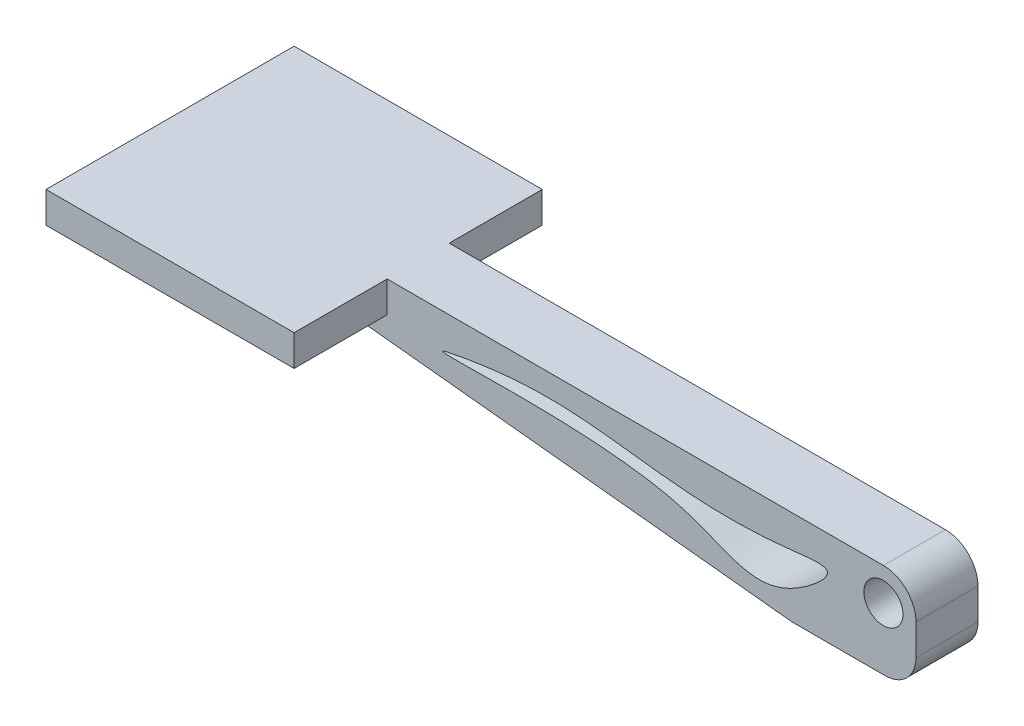
ISO-10303-21;
HEADER;
FILE_DESCRIPTION(('STEP AP214'),'2;1');
FILE_NAME('part.step','',(''),(''),'','','');
FILE_SCHEMA(('AUTOMOTIVE_DESIGN { 1 0 10303 214 1 1 1 1 }'));
ENDSEC;
DATA;
#1=APPLICATION_CONTEXT('core data for automotive mechanical design processes');
#2=APPLICATION_PROTOCOL_DEFINITION('international standard','automotive_design',2000,#1);
#3=PRODUCT_CONTEXT('',#1,'mechanical');
#4=PRODUCT('Part','Part','',(#3));
#5=PRODUCT_RELATED_PRODUCT_CATEGORY('part','',(#4));
#6=PRODUCT_DEFINITION_FORMATION('','',#4);
#7=PRODUCT_DEFINITION_CONTEXT('part definition',#1,'design');
#8=PRODUCT_DEFINITION('design','',#6,#7);
#9=PRODUCT_DEFINITION_SHAPE('','',#8);
#10=(LENGTH_UNIT() NAMED_UNIT(*) SI_UNIT(.MILLI.,.METRE.));
#11=(NAMED_UNIT(*) PLANE_ANGLE_UNIT() SI_UNIT($,.RADIAN.));
#12=(NAMED_UNIT(*) SI_UNIT($,.STERADIAN.) SOLID_ANGLE_UNIT());
#13=UNCERTAINTY_MEASURE_WITH_UNIT(LENGTH_MEASURE(1.E-05),#10,'distance_accuracy_value','');
#14=(GEOMETRIC_REPRESENTATION_CONTEXT(3) GLOBAL_UNCERTAINTY_ASSIGNED_CONTEXT((#13)) GLOBAL_UNIT_ASSIGNED_CONTEXT((#10,
#11,#12)) REPRESENTATION_CONTEXT('',''));
#15=CARTESIAN_POINT('',(0.,0.,0.));
#16=DIRECTION('',(0.,0.,1.));
#17=DIRECTION('',(1.,0.,0.));
#18=AXIS2_PLACEMENT_3D('',#15,#16,#17);
#19=CARTESIAN_POINT('',(-232.485951851655,5.29440272759926,-10.));
#20=DIRECTION('',(0.,0.,1.));
#21=DIRECTION('',(1.,0.,0.));
#22=AXIS2_PLACEMENT_3D('',#19,#20,#21);
#23=CYLINDRICAL_SURFACE('',#22,7.5);
#24=DIRECTION('',(0.,0.,1.));
#25=VECTOR('',#24,1.);
#26=CARTESIAN_POINT('',(-238.25342118279,0.499999999999965,-10.));
#27=LINE('',#26,#25);
#28=CARTESIAN_POINT('',(-238.25342118279,0.499999999999965,-10.));
#29=VERTEX_POINT('',#28);
#30=CARTESIAN_POINT('',(-238.25342118279,0.499999999999965,10.));
#31=VERTEX_POINT('',#30);
#32=EDGE_CURVE('E179',#29,#31,#27,.T.);
#33=ORIENTED_EDGE('',*,*,#32,.F.);
#34=CARTESIAN_POINT('',(-232.485951851655,5.29440272759926,-10.));
#35=DIRECTION('',(0.,0.,1.));
#36=DIRECTION('',(1.,0.,0.));
#37=AXIS2_PLACEMENT_3D('',#34,#35,#36);
#38=CIRCLE('',#37,7.5);
#39=CARTESIAN_POINT('',(-232.485951851655,-2.20559727240074,-10.));
#40=VERTEX_POINT('',#39);
#41=EDGE_CURVE('E230',#40,#29,#38,.F.);
#42=ORIENTED_EDGE('',*,*,#41,.F.);
#43=DIRECTION('',(0.,0.,1.));
#44=VECTOR('',#43,1.);
#45=CARTESIAN_POINT('',(-232.485951851655,-2.20559727240074,-10.));
#46=LINE('',#45,#44);
#47=CARTESIAN_POINT('',(-232.485951851655,-2.20559727240074,10.));
#48=VERTEX_POINT('',#47);
#49=EDGE_CURVE('E307',#40,#48,#46,.T.);
#50=ORIENTED_EDGE('',*,*,#49,.T.);
#51=CARTESIAN_POINT('',(-232.485951851655,5.29440272759926,10.));
#52=DIRECTION('',(0.,0.,1.));
#53=DIRECTION('',(1.,0.,0.));
#54=AXIS2_PLACEMENT_3D('',#51,#52,#53);
#55=CIRCLE('',#54,7.5);
#56=EDGE_CURVE('E193',#48,#31,#55,.F.);
#57=ORIENTED_EDGE('',*,*,#56,.T.);
#58=EDGE_LOOP('',(#33,#42,#50,#57));
#59=FACE_BOUND('',#58,.T.);
#60=ADVANCED_FACE('F39',(#59),#23,.T.);
#61=CARTESIAN_POINT('',(0.,0.,-10.));
#62=DIRECTION('',(0.,0.,1.));
#63=DIRECTION('',(1.,0.,0.));
#64=AXIS2_PLACEMENT_3D('',#61,#62,#63);
#65=CYLINDRICAL_SURFACE('',#64,10.5);
#66=DIRECTION('',(0.,0.,1.));
#67=VECTOR('',#66,1.);
#68=CARTESIAN_POINT('',(0.,10.5,-10.));
#69=LINE('',#68,#67);
#70=CARTESIAN_POINT('',(0.,10.5,-10.));
#71=VERTEX_POINT('',#70);
#72=CARTESIAN_POINT('',(0.,10.5,10.));
#73=VERTEX_POINT('',#72);
#74=EDGE_CURVE('E254',#71,#73,#69,.T.);
#75=ORIENTED_EDGE('',*,*,#74,.T.);
#76=CARTESIAN_POINT('',(0.,0.,10.));
#77=DIRECTION('',(0.,0.,1.));
#78=DIRECTION('',(1.,0.,0.));
#79=AXIS2_PLACEMENT_3D('',#76,#77,#78);
#80=CIRCLE('',#79,10.5);
#81=CARTESIAN_POINT('',(10.5,0.,10.));
#82=VERTEX_POINT('',#81);
#83=EDGE_CURVE('E188',#82,#73,#80,.T.);
#84=ORIENTED_EDGE('',*,*,#83,.F.);
#85=DIRECTION('',(0.,0.,1.));
#86=VECTOR('',#85,1.);
#87=CARTESIAN_POINT('',(10.5,0.,-10.));
#88=LINE('',#87,#86);
#89=CARTESIAN_POINT('',(10.5,0.,-10.));
#90=VERTEX_POINT('',#89);
#91=EDGE_CURVE('E255',#90,#82,#88,.T.);
#92=ORIENTED_EDGE('',*,*,#91,.F.);
#93=CARTESIAN_POINT('',(0.,0.,-10.));
#94=DIRECTION('',(0.,0.,1.));
#95=DIRECTION('',(1.,0.,0.));
#96=AXIS2_PLACEMENT_3D('',#93,#94,#95);
#97=CIRCLE('',#96,10.5);
#98=EDGE_CURVE('E225',#90,#71,#97,.T.);
#99=ORIENTED_EDGE('',*,*,#98,.T.);
#100=EDGE_LOOP('',(#75,#84,#92,#99));
#101=FACE_BOUND('',#100,.T.);
#102=ADVANCED_FACE('F272',(#101),#65,.T.);
#103=CARTESIAN_POINT('',(10.5,0.,-10.));
#104=DIRECTION('',(-1.,0.,0.));
#105=DIRECTION('',(0.,0.,1.));
#106=AXIS2_PLACEMENT_3D('',#103,#104,#105);
#107=PLANE('',#106);
#108=ORIENTED_EDGE('',*,*,#91,.T.);
#109=DIRECTION('',(0.,-1.,0.));
#110=VECTOR('',#109,1.);
#111=CARTESIAN_POINT('',(10.5,0.,10.));
#112=LINE('',#111,#110);
#113=CARTESIAN_POINT('',(10.5,-9.99999999999993,10.));
#114=VERTEX_POINT('',#113);
#115=EDGE_CURVE('E211',#82,#114,#112,.T.);
#116=ORIENTED_EDGE('',*,*,#115,.T.);
#117=DIRECTION('',(0.,0.,1.));
#118=VECTOR('',#117,1.);
#119=CARTESIAN_POINT('',(10.5,-9.99999999999993,-10.));
#120=LINE('',#119,#118);
#121=CARTESIAN_POINT('',(10.5,-9.99999999999993,-10.));
#122=VERTEX_POINT('',#121);
#123=EDGE_CURVE('E320',#122,#114,#120,.T.);
#124=ORIENTED_EDGE('',*,*,#123,.F.);
#125=DIRECTION('',(0.,-1.,0.));
#126=VECTOR('',#125,1.);
#127=CARTESIAN_POINT('',(10.5,0.,-10.));
#128=LINE('',#127,#126);
#129=EDGE_CURVE('E246',#90,#122,#128,.T.);
#130=ORIENTED_EDGE('',*,*,#129,.F.);
#131=EDGE_LOOP('',(#108,#116,#124,#130));
#132=FACE_BOUND('',#131,.T.);
#133=ADVANCED_FACE('F268',(#132),#107,.F.);
#134=CARTESIAN_POINT('',(0.500000000000002,-10.,-10.));
#135=DIRECTION('',(0.,0.,1.));
#136=DIRECTION('',(1.,0.,0.));
#137=AXIS2_PLACEMENT_3D('',#134,#135,#136);
#138=CYLINDRICAL_SURFACE('',#137,10.);
#139=ORIENTED_EDGE('',*,*,#123,.T.);
#140=CARTESIAN_POINT('',(0.500000000000002,-10.,10.));
#141=DIRECTION('',(0.,0.,1.));
#142=DIRECTION('',(1.,0.,0.));
#143=AXIS2_PLACEMENT_3D('',#140,#141,#142);
#144=CIRCLE('',#143,10.);
#145=CARTESIAN_POINT('',(0.499999999999931,-20.,10.));
#146=VERTEX_POINT('',#145);
#147=EDGE_CURVE('E208',#146,#114,#144,.T.);
#148=ORIENTED_EDGE('',*,*,#147,.F.);
#149=DIRECTION('',(0.,0.,1.));
#150=VECTOR('',#149,1.);
#151=CARTESIAN_POINT('',(0.499999999999931,-20.,-10.));
#152=LINE('',#151,#150);
#153=CARTESIAN_POINT('',(0.499999999999931,-20.,-10.));
#154=VERTEX_POINT('',#153);
#155=EDGE_CURVE('E321',#154,#146,#152,.T.);
#156=ORIENTED_EDGE('',*,*,#155,.F.);
#157=CARTESIAN_POINT('',(0.500000000000002,-10.,-10.));
#158=DIRECTION('',(0.,0.,1.));
#159=DIRECTION('',(1.,0.,0.));
#160=AXIS2_PLACEMENT_3D('',#157,#158,#159);
#161=CIRCLE('',#160,10.);
#162=EDGE_CURVE('E243',#154,#122,#161,.T.);
#163=ORIENTED_EDGE('',*,*,#162,.T.);
#164=EDGE_LOOP('',(#139,#148,#156,#163));
#165=FACE_BOUND('',#164,.T.);
#166=ADVANCED_FACE('F271',(#165),#138,.T.);
#167=CARTESIAN_POINT('',(0.,-20.,-10.));
#168=DIRECTION('',(0.,1.,0.));
#169=DIRECTION('',(-1.,0.,0.));
#170=AXIS2_PLACEMENT_3D('',#167,#168,#169);
#171=PLANE('',#170);
#172=ORIENTED_EDGE('',*,*,#155,.T.);
#173=DIRECTION('',(-1.,0.,0.));
#174=VECTOR('',#173,1.);
#175=CARTESIAN_POINT('',(0.,-20.,10.));
#176=LINE('',#175,#174);
#177=CARTESIAN_POINT('',(-29.5,-20.,10.));
#178=VERTEX_POINT('',#177);
#179=EDGE_CURVE('E205',#146,#178,#176,.T.);
#180=ORIENTED_EDGE('',*,*,#179,.T.);
#181=DIRECTION('',(0.,0.,1.));
#182=VECTOR('',#181,1.);
#183=CARTESIAN_POINT('',(-29.5,-20.,-10.));
#184=LINE('',#183,#182);
#185=CARTESIAN_POINT('',(-29.5,-20.,-10.));
#186=VERTEX_POINT('',#185);
#187=EDGE_CURVE('E322',#186,#178,#184,.T.);
#188=ORIENTED_EDGE('',*,*,#187,.F.);
#189=DIRECTION('',(-1.,0.,0.));
#190=VECTOR('',#189,1.);
#191=CARTESIAN_POINT('',(0.,-20.,-10.));
#192=LINE('',#191,#190);
#193=EDGE_CURVE('E240',#154,#186,#192,.T.);
#194=ORIENTED_EDGE('',*,*,#193,.F.);
#195=EDGE_LOOP('',(#172,#180,#188,#194));
#196=FACE_BOUND('',#195,.T.);
#197=ADVANCED_FACE('F276',(#196),#171,.F.);
#198=CARTESIAN_POINT('',(-2.38316479186402,-22.830584044961,-10.));
#199=DIRECTION('',(0.103820657672118,0.994596034096522,0.));
#200=DIRECTION('',(-0.994596034096522,0.103820657672118,0.));
#201=AXIS2_PLACEMENT_3D('',#198,#199,#200);
#202=PLANE('',#201);
#203=ORIENTED_EDGE('',*,*,#187,.T.);
#204=DIRECTION('',(-0.994596034096522,0.103820657672118,0.));
#205=VECTOR('',#204,1.);
#206=CARTESIAN_POINT('',(-2.38316479186402,-22.830584044961,10.));
#207=LINE('',#206,#205);
#208=CARTESIAN_POINT('',(-198.933978894846,-2.31367659047031,10.));
#209=VERTEX_POINT('',#208);
#210=EDGE_CURVE('E202',#178,#209,#207,.T.);
#211=ORIENTED_EDGE('',*,*,#210,.T.);
#212=DIRECTION('',(0.,0.,1.));
#213=VECTOR('',#212,1.);
#214=CARTESIAN_POINT('',(-198.933978894846,-2.31367659047031,-10.));
#215=LINE('',#214,#213);
#216=CARTESIAN_POINT('',(-198.933978894846,-2.31367659047031,-10.));
#217=VERTEX_POINT('',#216);
#218=EDGE_CURVE('E326',#217,#209,#215,.T.);
#219=ORIENTED_EDGE('',*,*,#218,.F.);
#220=DIRECTION('',(-0.994596034096522,0.103820657672118,0.));
#221=VECTOR('',#220,1.);
#222=CARTESIAN_POINT('',(-2.38316479186402,-22.830584044961,-10.));
#223=LINE('',#222,#221);
#224=EDGE_CURVE('E238',#186,#217,#223,.T.);
#225=ORIENTED_EDGE('',*,*,#224,.F.);
#226=EDGE_LOOP('',(#203,#211,#219,#225));
#227=FACE_BOUND('',#226,.T.);
#228=ADVANCED_FACE('F280',(#227),#202,.F.);
#229=CARTESIAN_POINT('',(-201.010392048289,-22.2055972724007,-10.));
#230=DIRECTION('',(0.,0.,1.));
#231=DIRECTION('',(1.,0.,0.));
#232=AXIS2_PLACEMENT_3D('',#229,#230,#231);
#233=CYLINDRICAL_SURFACE('',#232,20.);
#234=ORIENTED_EDGE('',*,*,#218,.T.);
#235=CARTESIAN_POINT('',(-201.010392048289,-22.2055972724007,10.));
#236=DIRECTION('',(0.,0.,1.));
#237=DIRECTION('',(1.,0.,0.));
#238=AXIS2_PLACEMENT_3D('',#235,#236,#237);
#239=CIRCLE('',#238,20.);
#240=CARTESIAN_POINT('',(-201.010392048289,-2.20559727240074,10.));
#241=VERTEX_POINT('',#240);
#242=EDGE_CURVE('E199',#241,#209,#239,.F.);
#243=ORIENTED_EDGE('',*,*,#242,.F.);
#244=DIRECTION('',(0.,0.,1.));
#245=VECTOR('',#244,1.);
#246=CARTESIAN_POINT('',(-201.010392048289,-2.20559727240074,-10.));
#247=LINE('',#246,#245);
#248=CARTESIAN_POINT('',(-201.010392048289,-2.20559727240074,-10.));
#249=VERTEX_POINT('',#248);
#250=EDGE_CURVE('E328',#249,#241,#247,.T.);
#251=ORIENTED_EDGE('',*,*,#250,.F.);
#252=CARTESIAN_POINT('',(-201.010392048289,-22.2055972724007,-10.));
#253=DIRECTION('',(0.,0.,1.));
#254=DIRECTION('',(1.,0.,0.));
#255=AXIS2_PLACEMENT_3D('',#252,#253,#254);
#256=CIRCLE('',#255,20.);
#257=EDGE_CURVE('E235',#249,#217,#256,.F.);
#258=ORIENTED_EDGE('',*,*,#257,.T.);
#259=EDGE_LOOP('',(#234,#243,#251,#258));
#260=FACE_BOUND('',#259,.T.);
#261=ADVANCED_FACE('F284',(#260),#233,.F.);
#262=CARTESIAN_POINT('',(0.,-2.20559727240071,-10.));
#263=DIRECTION('',(0.,1.,0.));
#264=DIRECTION('',(-1.,0.,0.));
#265=AXIS2_PLACEMENT_3D('',#262,#263,#264);
#266=PLANE('',#265);
#267=ORIENTED_EDGE('',*,*,#250,.T.);
#268=DIRECTION('',(-1.,0.,0.));
#269=VECTOR('',#268,1.);
#270=CARTESIAN_POINT('',(0.,-2.20559727240071,10.));
#271=LINE('',#270,#269);
#272=EDGE_CURVE('E196',#241,#48,#271,.T.);
#273=ORIENTED_EDGE('',*,*,#272,.T.);
#274=ORIENTED_EDGE('',*,*,#49,.F.);
#275=DIRECTION('',(-1.,0.,0.));
#276=VECTOR('',#275,1.);
#277=CARTESIAN_POINT('',(0.,-2.20559727240071,-10.));
#278=LINE('',#277,#276);
#279=EDGE_CURVE('E232',#249,#40,#278,.T.);
#280=ORIENTED_EDGE('',*,*,#279,.F.);
#281=EDGE_LOOP('',(#267,#273,#274,#280));
#282=FACE_BOUND('',#281,.T.);
#283=ADVANCED_FACE('F288',(#282),#266,.F.);
#284=CARTESIAN_POINT('',(0.,10.5,-10.));
#285=DIRECTION('',(0.,1.,0.));
#286=DIRECTION('',(-1.,0.,0.));
#287=AXIS2_PLACEMENT_3D('',#284,#285,#286);
#288=PLANE('',#287);
#289=DIRECTION('',(-1.,0.,0.));
#290=VECTOR('',#289,1.);
#291=CARTESIAN_POINT('',(0.,10.5,-10.));
#292=LINE('',#291,#290);
#293=CARTESIAN_POINT('',(-160.,10.5,-10.));
#294=VERTEX_POINT('',#293);
#295=EDGE_CURVE('E228',#71,#294,#292,.T.);
#296=ORIENTED_EDGE('',*,*,#295,.T.);
#297=DIRECTION('',(0.,0.,-1.));
#298=VECTOR('',#297,1.);
#299=CARTESIAN_POINT('',(-160.,10.5,0.));
#300=LINE('',#299,#298);
#301=CARTESIAN_POINT('',(-160.,10.5,-40.));
#302=VERTEX_POINT('',#301);
#303=EDGE_CURVE('E343',#294,#302,#300,.T.);
#304=ORIENTED_EDGE('',*,*,#303,.T.);
#305=DIRECTION('',(1.,0.,0.));
#306=VECTOR('',#305,1.);
#307=CARTESIAN_POINT('',(0.,10.5,-40.));
#308=LINE('',#307,#306);
#309=CARTESIAN_POINT('',(-240.,10.5,-40.));
#310=VERTEX_POINT('',#309);
#311=EDGE_CURVE('E169',#310,#302,#308,.T.);
#312=ORIENTED_EDGE('',*,*,#311,.F.);
#313=DIRECTION('',(0.,0.,-1.));
#314=VECTOR('',#313,1.);
#315=CARTESIAN_POINT('',(-240.,10.5,0.));
#316=LINE('',#315,#314);
#317=CARTESIAN_POINT('',(-240.,10.5,40.));
#318=VERTEX_POINT('',#317);
#319=EDGE_CURVE('E348',#318,#310,#316,.T.);
#320=ORIENTED_EDGE('',*,*,#319,.F.);
#321=DIRECTION('',(1.,0.,0.));
#322=VECTOR('',#321,1.);
#323=CARTESIAN_POINT('',(0.,10.5,40.));
#324=LINE('',#323,#322);
#325=CARTESIAN_POINT('',(-160.,10.5,40.));
#326=VERTEX_POINT('',#325);
#327=EDGE_CURVE('E155',#318,#326,#324,.T.);
#328=ORIENTED_EDGE('',*,*,#327,.T.);
#329=CARTESIAN_POINT('',(-160.,10.5,10.));
#330=VERTEX_POINT('',#329);
#331=EDGE_CURVE('E312',#326,#330,#300,.T.);
#332=ORIENTED_EDGE('',*,*,#331,.T.);
#333=DIRECTION('',(-1.,0.,0.));
#334=VECTOR('',#333,1.);
#335=CARTESIAN_POINT('',(0.,10.5,10.));
#336=LINE('',#335,#334);
#337=EDGE_CURVE('E191',#73,#330,#336,.T.);
#338=ORIENTED_EDGE('',*,*,#337,.F.);
#339=ORIENTED_EDGE('',*,*,#74,.F.);
#340=EDGE_LOOP('',(#296,#304,#312,#320,#328,#332,#338,#339));
#341=FACE_BOUND('',#340,.T.);
#342=ADVANCED_FACE('F292',(#341),#288,.T.);
#343=CARTESIAN_POINT('',(0.,0.,-10.));
#344=DIRECTION('',(0.,0.,1.));
#345=DIRECTION('',(1.,0.,0.));
#346=AXIS2_PLACEMENT_3D('',#343,#344,#345);
#347=CYLINDRICAL_SURFACE('',#346,6.3);
#348=CARTESIAN_POINT('',(0.,0.,-10.));
#349=DIRECTION('',(0.,0.,1.));
#350=DIRECTION('',(1.,0.,0.));
#351=AXIS2_PLACEMENT_3D('',#348,#349,#350);
#352=CIRCLE('',#351,6.3);
#353=CARTESIAN_POINT('',(6.3,0.,-10.));
#354=VERTEX_POINT('',#353);
#355=EDGE_CURVE('E219',#354,#354,#352,.T.);
#356=ORIENTED_EDGE('',*,*,#355,.F.);
#357=EDGE_LOOP('',(#356));
#358=FACE_BOUND('',#357,.T.);
#359=CARTESIAN_POINT('',(0.,0.,10.));
#360=DIRECTION('',(0.,0.,1.));
#361=DIRECTION('',(1.,0.,0.));
#362=AXIS2_PLACEMENT_3D('',#359,#360,#361);
#363=CIRCLE('',#362,6.3);
#364=CARTESIAN_POINT('',(6.3,0.,10.));
#365=VERTEX_POINT('',#364);
#366=EDGE_CURVE('E185',#365,#365,#363,.T.);
#367=ORIENTED_EDGE('',*,*,#366,.T.);
#368=EDGE_LOOP('',(#367));
#369=FACE_BOUND('',#368,.T.);
#370=ADVANCED_FACE('F41',(#358,#369),#347,.F.);
#371=CARTESIAN_POINT('',(-29.5,0.,-10.));
#372=CARTESIAN_POINT('',(-71.215452783542,-4.61892144301834,-10.));
#373=CARTESIAN_POINT('',(-91.249553359035,8.29560441948552,-10.));
#374=CARTESIAN_POINT('',(-167.314221677609,-4.51637823923124,-10.));
#375=CARTESIAN_POINT('',(-66.6604627525352,5.70599052736749,-10.));
#376=CARTESIAN_POINT('',(-39.3547437867582,-20.8236487299259,-10.));
#377=CARTESIAN_POINT('',(-11.8773746369472,2.38963550250183,-10.));
#378=CARTESIAN_POINT('',(-24.5233427174819,0.551037745078615,-10.));
#379=CARTESIAN_POINT('',(-29.5,0.,-10.));
#380=B_SPLINE_CURVE_WITH_KNOTS('',3,(#371,#372,#373,#374,#375,#376,#377,#378,#379),
.UNSPECIFIED.,.T.,.F.,(4,1,1,1,1,1,4),(0.,0.381705306503049,0.445280413079072,0.748987595762117,
0.891875490341652,0.954462522479591,1.),.UNSPECIFIED.);
#381=DIRECTION('',(0.,0.,1.));
#382=VECTOR('',#381,1.);
#383=SURFACE_OF_LINEAR_EXTRUSION('',#380,#382);
#384=CARTESIAN_POINT('',(-29.5,0.,-10.));
#385=VERTEX_POINT('',#384);
#386=EDGE_CURVE('E248',#385,#385,#380,.T.);
#387=ORIENTED_EDGE('',*,*,#386,.F.);
#388=EDGE_LOOP('',(#387));
#389=FACE_BOUND('',#388,.T.);
#390=CARTESIAN_POINT('',(-29.5,0.,10.));
#391=CARTESIAN_POINT('',(-71.215452783542,-4.61892144301834,10.));
#392=CARTESIAN_POINT('',(-91.249553359035,8.29560441948552,10.));
#393=CARTESIAN_POINT('',(-167.314221677609,-4.51637823923124,10.));
#394=CARTESIAN_POINT('',(-66.6604627525352,5.70599052736749,10.));
#395=CARTESIAN_POINT('',(-39.3547437867582,-20.8236487299259,10.));
#396=CARTESIAN_POINT('',(-11.8773746369472,2.38963550250183,10.));
#397=CARTESIAN_POINT('',(-24.5233427174819,0.551037745078615,10.));
#398=CARTESIAN_POINT('',(-29.5,0.,10.));
#399=B_SPLINE_CURVE_WITH_KNOTS('',3,(#390,#391,#392,#393,#394,#395,#396,#397,#398),
.UNSPECIFIED.,.T.,.F.,(4,1,1,1,1,1,4),(0.,0.381705306503049,0.445280413079072,0.748987595762117,
0.891875490341652,0.954462522479591,1.),.UNSPECIFIED.);
#400=CARTESIAN_POINT('',(-29.5,0.,10.));
#401=VERTEX_POINT('',#400);
#402=EDGE_CURVE('E214',#401,#401,#399,.T.);
#403=ORIENTED_EDGE('',*,*,#402,.T.);
#404=EDGE_LOOP('',(#403));
#405=FACE_BOUND('',#404,.T.);
#406=ADVANCED_FACE('F261',(#389,#405),#383,.F.);
#407=CARTESIAN_POINT('',(0.,0.,-10.));
#408=DIRECTION('',(0.,0.,1.));
#409=DIRECTION('',(1.,0.,0.));
#410=AXIS2_PLACEMENT_3D('',#407,#408,#409);
#411=PLANE('',#410);
#412=ORIENTED_EDGE('',*,*,#355,.T.);
#413=EDGE_LOOP('',(#412));
#414=FACE_BOUND('',#413,.T.);
#415=DIRECTION('',(-1.,0.,0.));
#416=VECTOR('',#415,1.);
#417=CARTESIAN_POINT('',(0.,0.5,-10.));
#418=LINE('',#417,#416);
#419=CARTESIAN_POINT('',(-160.,0.499999999999976,-10.));
#420=VERTEX_POINT('',#419);
#421=EDGE_CURVE('E54',#420,#29,#418,.T.);
#422=ORIENTED_EDGE('',*,*,#421,.F.);
#423=DIRECTION('',(0.,1.,0.));
#424=VECTOR('',#423,1.);
#425=CARTESIAN_POINT('',(-160.,0.,-10.));
#426=LINE('',#425,#424);
#427=EDGE_CURVE('E58',#420,#294,#426,.T.);
#428=ORIENTED_EDGE('',*,*,#427,.T.);
#429=ORIENTED_EDGE('',*,*,#295,.F.);
#430=ORIENTED_EDGE('',*,*,#98,.F.);
#431=ORIENTED_EDGE('',*,*,#129,.T.);
#432=ORIENTED_EDGE('',*,*,#162,.F.);
#433=ORIENTED_EDGE('',*,*,#193,.T.);
#434=ORIENTED_EDGE('',*,*,#224,.T.);
#435=ORIENTED_EDGE('',*,*,#257,.F.);
#436=ORIENTED_EDGE('',*,*,#279,.T.);
#437=ORIENTED_EDGE('',*,*,#41,.T.);
#438=EDGE_LOOP('',(#422,#428,#429,#430,#431,#432,#433,#434,#435,#436,#437));
#439=FACE_BOUND('',#438,.T.);
#440=ORIENTED_EDGE('',*,*,#386,.T.);
#441=EDGE_LOOP('',(#440));
#442=FACE_BOUND('',#441,.T.);
#443=ADVANCED_FACE('F265',(#414,#439,#442),#411,.F.);
#444=CARTESIAN_POINT('',(0.,0.,10.));
#445=DIRECTION('',(0.,0.,1.));
#446=DIRECTION('',(1.,0.,0.));
#447=AXIS2_PLACEMENT_3D('',#444,#445,#446);
#448=PLANE('',#447);
#449=DIRECTION('',(0.,1.,0.));
#450=VECTOR('',#449,1.);
#451=CARTESIAN_POINT('',(-160.,0.,10.));
#452=LINE('',#451,#450);
#453=CARTESIAN_POINT('',(-160.,0.499999999999976,10.));
#454=VERTEX_POINT('',#453);
#455=EDGE_CURVE('E11',#454,#330,#452,.T.);
#456=ORIENTED_EDGE('',*,*,#455,.F.);
#457=DIRECTION('',(-1.,0.,0.));
#458=VECTOR('',#457,1.);
#459=CARTESIAN_POINT('',(0.,0.5,10.));
#460=LINE('',#459,#458);
#461=EDGE_CURVE('E47',#454,#31,#460,.T.);
#462=ORIENTED_EDGE('',*,*,#461,.T.);
#463=ORIENTED_EDGE('',*,*,#56,.F.);
#464=ORIENTED_EDGE('',*,*,#272,.F.);
#465=ORIENTED_EDGE('',*,*,#242,.T.);
#466=ORIENTED_EDGE('',*,*,#210,.F.);
#467=ORIENTED_EDGE('',*,*,#179,.F.);
#468=ORIENTED_EDGE('',*,*,#147,.T.);
#469=ORIENTED_EDGE('',*,*,#115,.F.);
#470=ORIENTED_EDGE('',*,*,#83,.T.);
#471=ORIENTED_EDGE('',*,*,#337,.T.);
#472=EDGE_LOOP('',(#456,#462,#463,#464,#465,#466,#467,#468,#469,#470,#471));
#473=FACE_BOUND('',#472,.T.);
#474=ORIENTED_EDGE('',*,*,#366,.F.);
#475=EDGE_LOOP('',(#474));
#476=FACE_BOUND('',#475,.T.);
#477=ORIENTED_EDGE('',*,*,#402,.F.);
#478=EDGE_LOOP('',(#477));
#479=FACE_BOUND('',#478,.T.);
#480=ADVANCED_FACE('F314',(#473,#476,#479),#448,.T.);
#481=CARTESIAN_POINT('',(-160.,0.499999999999976,0.));
#482=DIRECTION('',(1.,0.,0.));
#483=DIRECTION('',(0.,1.,0.));
#484=AXIS2_PLACEMENT_3D('',#481,#482,#483);
#485=PLANE('',#484);
#486=ORIENTED_EDGE('',*,*,#427,.F.);
#487=DIRECTION('',(0.,0.,-1.));
#488=VECTOR('',#487,1.);
#489=CARTESIAN_POINT('',(-160.,0.499999999999976,0.));
#490=LINE('',#489,#488);
#491=CARTESIAN_POINT('',(-160.,0.499999999999976,-40.));
#492=VERTEX_POINT('',#491);
#493=EDGE_CURVE('E146',#420,#492,#490,.T.);
#494=ORIENTED_EDGE('',*,*,#493,.T.);
#495=DIRECTION('',(0.,1.,0.));
#496=VECTOR('',#495,1.);
#497=CARTESIAN_POINT('',(-160.,0.499999999999976,-40.));
#498=LINE('',#497,#496);
#499=EDGE_CURVE('E151',#492,#302,#498,.T.);
#500=ORIENTED_EDGE('',*,*,#499,.T.);
#501=ORIENTED_EDGE('',*,*,#303,.F.);
#502=EDGE_LOOP('',(#486,#494,#500,#501));
#503=FACE_BOUND('',#502,.T.);
#504=ADVANCED_FACE('F148',(#503),#485,.T.);
#505=CARTESIAN_POINT('',(0.,0.5,0.));
#506=DIRECTION('',(0.,1.,0.));
#507=DIRECTION('',(-1.,0.,0.));
#508=AXIS2_PLACEMENT_3D('',#505,#506,#507);
#509=PLANE('',#508);
#510=ORIENTED_EDGE('',*,*,#493,.F.);
#511=ORIENTED_EDGE('',*,*,#421,.T.);
#512=ORIENTED_EDGE('',*,*,#32,.T.);
#513=ORIENTED_EDGE('',*,*,#461,.F.);
#514=CARTESIAN_POINT('',(-160.,0.499999999999976,40.));
#515=VERTEX_POINT('',#514);
#516=EDGE_CURVE('E154',#515,#454,#490,.T.);
#517=ORIENTED_EDGE('',*,*,#516,.F.);
#518=DIRECTION('',(1.,0.,0.));
#519=VECTOR('',#518,1.);
#520=CARTESIAN_POINT('',(0.,0.5,40.));
#521=LINE('',#520,#519);
#522=CARTESIAN_POINT('',(-240.,0.499999999999964,40.));
#523=VERTEX_POINT('',#522);
#524=EDGE_CURVE('E171',#523,#515,#521,.T.);
#525=ORIENTED_EDGE('',*,*,#524,.F.);
#526=DIRECTION('',(0.,0.,-1.));
#527=VECTOR('',#526,1.);
#528=CARTESIAN_POINT('',(-240.,0.499999999999964,0.));
#529=LINE('',#528,#527);
#530=CARTESIAN_POINT('',(-240.,0.499999999999964,-40.));
#531=VERTEX_POINT('',#530);
#532=EDGE_CURVE('E162',#523,#531,#529,.T.);
#533=ORIENTED_EDGE('',*,*,#532,.T.);
#534=DIRECTION('',(1.,0.,0.));
#535=VECTOR('',#534,1.);
#536=CARTESIAN_POINT('',(0.,0.5,-40.));
#537=LINE('',#536,#535);
#538=EDGE_CURVE('E158',#531,#492,#537,.T.);
#539=ORIENTED_EDGE('',*,*,#538,.T.);
#540=EDGE_LOOP('',(#510,#511,#512,#513,#517,#525,#533,#539));
#541=FACE_BOUND('',#540,.T.);
#542=ADVANCED_FACE('F159',(#541),#509,.F.);
#543=ORIENTED_EDGE('',*,*,#516,.T.);
#544=ORIENTED_EDGE('',*,*,#455,.T.);
#545=ORIENTED_EDGE('',*,*,#331,.F.);
#546=DIRECTION('',(0.,1.,0.));
#547=VECTOR('',#546,1.);
#548=CARTESIAN_POINT('',(-160.,0.499999999999976,40.));
#549=LINE('',#548,#547);
#550=EDGE_CURVE('E182',#515,#326,#549,.T.);
#551=ORIENTED_EDGE('',*,*,#550,.F.);
#552=EDGE_LOOP('',(#543,#544,#545,#551));
#553=FACE_BOUND('',#552,.T.);
#554=ADVANCED_FACE('F360',(#553),#485,.T.);
#555=CARTESIAN_POINT('',(0.,0.5,40.));
#556=DIRECTION('',(0.,0.,1.));
#557=DIRECTION('',(1.,0.,0.));
#558=AXIS2_PLACEMENT_3D('',#555,#556,#557);
#559=PLANE('',#558);
#560=ORIENTED_EDGE('',*,*,#327,.F.);
#561=DIRECTION('',(0.,1.,0.));
#562=VECTOR('',#561,1.);
#563=CARTESIAN_POINT('',(-240.,0.499999999999964,40.));
#564=LINE('',#563,#562);
#565=EDGE_CURVE('E173',#523,#318,#564,.T.);
#566=ORIENTED_EDGE('',*,*,#565,.F.);
#567=ORIENTED_EDGE('',*,*,#524,.T.);
#568=ORIENTED_EDGE('',*,*,#550,.T.);
#569=EDGE_LOOP('',(#560,#566,#567,#568));
#570=FACE_BOUND('',#569,.T.);
#571=ADVANCED_FACE('F356',(#570),#559,.T.);
#572=CARTESIAN_POINT('',(-240.,0.499999999999964,0.));
#573=DIRECTION('',(1.,0.,0.));
#574=DIRECTION('',(0.,1.,0.));
#575=AXIS2_PLACEMENT_3D('',#572,#573,#574);
#576=PLANE('',#575);
#577=ORIENTED_EDGE('',*,*,#319,.T.);
#578=DIRECTION('',(0.,1.,0.));
#579=VECTOR('',#578,1.);
#580=CARTESIAN_POINT('',(-240.,0.499999999999964,-40.));
#581=LINE('',#580,#579);
#582=EDGE_CURVE('E170',#531,#310,#581,.T.);
#583=ORIENTED_EDGE('',*,*,#582,.F.);
#584=ORIENTED_EDGE('',*,*,#532,.F.);
#585=ORIENTED_EDGE('',*,*,#565,.T.);
#586=EDGE_LOOP('',(#577,#583,#584,#585));
#587=FACE_BOUND('',#586,.T.);
#588=ADVANCED_FACE('F353',(#587),#576,.F.);
#589=CARTESIAN_POINT('',(0.,0.5,-40.));
#590=DIRECTION('',(0.,0.,1.));
#591=DIRECTION('',(1.,0.,0.));
#592=AXIS2_PLACEMENT_3D('',#589,#590,#591);
#593=PLANE('',#592);
#594=ORIENTED_EDGE('',*,*,#311,.T.);
#595=ORIENTED_EDGE('',*,*,#499,.F.);
#596=ORIENTED_EDGE('',*,*,#538,.F.);
#597=ORIENTED_EDGE('',*,*,#582,.T.);
#598=EDGE_LOOP('',(#594,#595,#596,#597));
#599=FACE_BOUND('',#598,.T.);
#600=ADVANCED_FACE('F167',(#599),#593,.F.);
#601=CLOSED_SHELL('',(#60,#102,#133,#166,#197,#228,#261,#283,#342,#370,#406,#443,#480,#504,#542,
#554,#571,#588,#600));
#602=MANIFOLD_SOLID_BREP('B2',#601);
#603=ADVANCED_BREP_SHAPE_REPRESENTATION('',(#18,#602),#14);
#604=SHAPE_DEFINITION_REPRESENTATION(#9,#603);
ENDSEC;
END-ISO-10303-21;
